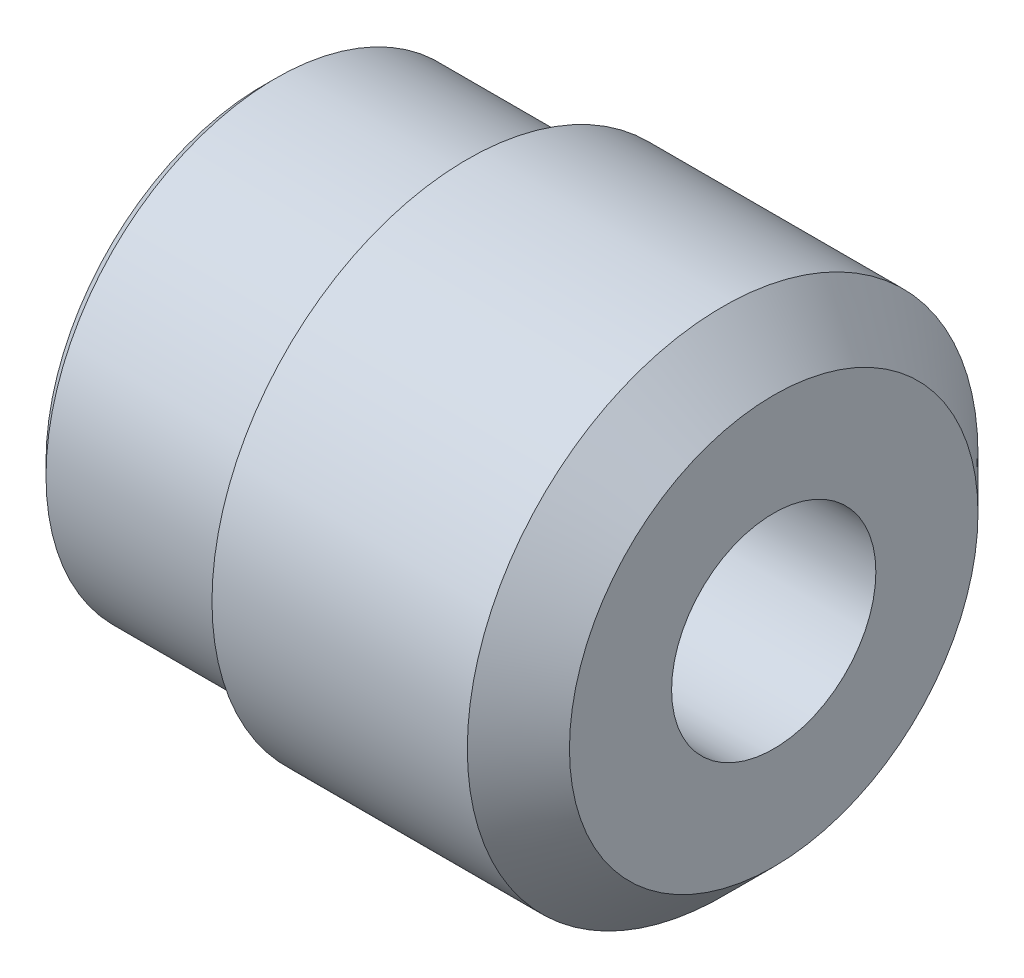
ISO-10303-21;
HEADER;
FILE_DESCRIPTION(('STEP AP214'),'2;1');
FILE_NAME('part.step','',(''),(''),'','','');
FILE_SCHEMA(('AUTOMOTIVE_DESIGN { 1 0 10303 214 1 1 1 1 }'));
ENDSEC;
DATA;
#1=APPLICATION_CONTEXT('core data for automotive mechanical design processes');
#2=APPLICATION_PROTOCOL_DEFINITION('international standard','automotive_design',2000,#1);
#3=PRODUCT_CONTEXT('',#1,'mechanical');
#4=PRODUCT('Part','Part','',(#3));
#5=PRODUCT_RELATED_PRODUCT_CATEGORY('part','',(#4));
#6=PRODUCT_DEFINITION_FORMATION('','',#4);
#7=PRODUCT_DEFINITION_CONTEXT('part definition',#1,'design');
#8=PRODUCT_DEFINITION('design','',#6,#7);
#9=PRODUCT_DEFINITION_SHAPE('','',#8);
#10=(LENGTH_UNIT() NAMED_UNIT(*) SI_UNIT(.MILLI.,.METRE.));
#11=(NAMED_UNIT(*) PLANE_ANGLE_UNIT() SI_UNIT($,.RADIAN.));
#12=(NAMED_UNIT(*) SI_UNIT($,.STERADIAN.) SOLID_ANGLE_UNIT());
#13=UNCERTAINTY_MEASURE_WITH_UNIT(LENGTH_MEASURE(1.E-05),#10,'distance_accuracy_value','');
#14=(GEOMETRIC_REPRESENTATION_CONTEXT(3) GLOBAL_UNCERTAINTY_ASSIGNED_CONTEXT((#13)) GLOBAL_UNIT_ASSIGNED_CONTEXT((#10,
#11,#12)) REPRESENTATION_CONTEXT('',''));
#15=CARTESIAN_POINT('',(0.,0.,0.));
#16=DIRECTION('',(0.,0.,1.));
#17=DIRECTION('',(1.,0.,0.));
#18=AXIS2_PLACEMENT_3D('',#15,#16,#17);
#19=CARTESIAN_POINT('',(0.,0.,0.));
#20=DIRECTION('',(-1.,0.,0.));
#21=DIRECTION('',(0.,0.,1.));
#22=AXIS2_PLACEMENT_3D('',#19,#20,#21);
#23=CYLINDRICAL_SURFACE('',#22,9.);
#24=CARTESIAN_POINT('',(0.500000000000004,0.,0.));
#25=DIRECTION('',(-1.,0.,0.));
#26=DIRECTION('',(0.,0.,1.));
#27=AXIS2_PLACEMENT_3D('',#24,#25,#26);
#28=CIRCLE('',#27,9.);
#29=CARTESIAN_POINT('',(0.500000000000004,0.,9.));
#30=VERTEX_POINT('',#29);
#31=EDGE_CURVE('E10',#30,#30,#28,.F.);
#32=ORIENTED_EDGE('',*,*,#31,.T.);
#33=EDGE_LOOP('',(#32));
#34=FACE_BOUND('',#33,.T.);
#35=CARTESIAN_POINT('',(8.,0.,0.));
#36=DIRECTION('',(-1.,0.,0.));
#37=DIRECTION('',(0.,0.,1.));
#38=AXIS2_PLACEMENT_3D('',#35,#36,#37);
#39=CIRCLE('',#38,9.);
#40=CARTESIAN_POINT('',(8.,0.,9.));
#41=VERTEX_POINT('',#40);
#42=EDGE_CURVE('E63',#41,#41,#39,.T.);
#43=ORIENTED_EDGE('',*,*,#42,.T.);
#44=EDGE_LOOP('',(#43));
#45=FACE_BOUND('',#44,.T.);
#46=ADVANCED_FACE('F29',(#34,#45),#23,.T.);
#47=CARTESIAN_POINT('',(0.,6.,0.));
#48=DIRECTION('',(-1.,0.,0.));
#49=DIRECTION('',(0.,0.,1.));
#50=AXIS2_PLACEMENT_3D('',#47,#48,#49);
#51=PLANE('',#50);
#52=CARTESIAN_POINT('',(0.,0.,0.));
#53=DIRECTION('',(-1.,0.,0.));
#54=DIRECTION('',(0.,0.,1.));
#55=AXIS2_PLACEMENT_3D('',#52,#53,#54);
#56=CIRCLE('',#55,8.49999999999999);
#57=CARTESIAN_POINT('',(0.,0.,8.49999999999999));
#58=VERTEX_POINT('',#57);
#59=EDGE_CURVE('E35',#58,#58,#56,.T.);
#60=ORIENTED_EDGE('',*,*,#59,.T.);
#61=EDGE_LOOP('',(#60));
#62=FACE_BOUND('',#61,.T.);
#63=CARTESIAN_POINT('',(0.,0.,0.));
#64=DIRECTION('',(-1.,0.,0.));
#65=DIRECTION('',(0.,0.,1.));
#66=AXIS2_PLACEMENT_3D('',#63,#64,#65);
#67=CIRCLE('',#66,6.);
#68=CARTESIAN_POINT('',(0.,0.,6.));
#69=VERTEX_POINT('',#68);
#70=EDGE_CURVE('E48',#69,#69,#67,.T.);
#71=ORIENTED_EDGE('',*,*,#70,.F.);
#72=EDGE_LOOP('',(#71));
#73=FACE_BOUND('',#72,.T.);
#74=ADVANCED_FACE('F85',(#62,#73),#51,.T.);
#75=CARTESIAN_POINT('',(0.,0.,0.));
#76=DIRECTION('',(-1.,0.,0.));
#77=DIRECTION('',(0.,0.,1.));
#78=AXIS2_PLACEMENT_3D('',#75,#76,#77);
#79=CYLINDRICAL_SURFACE('',#78,6.);
#80=CARTESIAN_POINT('',(14.,0.,0.));
#81=DIRECTION('',(-1.,0.,0.));
#82=DIRECTION('',(0.,0.,1.));
#83=AXIS2_PLACEMENT_3D('',#80,#81,#82);
#84=CIRCLE('',#83,6.);
#85=CARTESIAN_POINT('',(14.,0.,6.));
#86=VERTEX_POINT('',#85);
#87=EDGE_CURVE('E51',#86,#86,#84,.T.);
#88=ORIENTED_EDGE('',*,*,#87,.F.);
#89=EDGE_LOOP('',(#88));
#90=FACE_BOUND('',#89,.T.);
#91=ORIENTED_EDGE('',*,*,#70,.T.);
#92=EDGE_LOOP('',(#91));
#93=FACE_BOUND('',#92,.T.);
#94=ADVANCED_FACE('F89',(#90,#93),#79,.F.);
#95=CARTESIAN_POINT('',(14.,6.,0.));
#96=DIRECTION('',(1.,0.,0.));
#97=DIRECTION('',(0.,0.,-1.));
#98=AXIS2_PLACEMENT_3D('',#95,#96,#97);
#99=PLANE('',#98);
#100=CARTESIAN_POINT('',(14.,0.,0.));
#101=DIRECTION('',(-1.,0.,0.));
#102=DIRECTION('',(0.,0.,1.));
#103=AXIS2_PLACEMENT_3D('',#100,#101,#102);
#104=CIRCLE('',#103,4.);
#105=CARTESIAN_POINT('',(14.,0.,4.));
#106=VERTEX_POINT('',#105);
#107=EDGE_CURVE('E54',#106,#106,#104,.T.);
#108=ORIENTED_EDGE('',*,*,#107,.F.);
#109=EDGE_LOOP('',(#108));
#110=FACE_BOUND('',#109,.T.);
#111=ORIENTED_EDGE('',*,*,#87,.T.);
#112=EDGE_LOOP('',(#111));
#113=FACE_BOUND('',#112,.T.);
#114=ADVANCED_FACE('F93',(#110,#113),#99,.F.);
#115=CARTESIAN_POINT('',(0.,0.,0.));
#116=DIRECTION('',(-1.,0.,0.));
#117=DIRECTION('',(0.,0.,1.));
#118=AXIS2_PLACEMENT_3D('',#115,#116,#117);
#119=CYLINDRICAL_SURFACE('',#118,4.);
#120=CARTESIAN_POINT('',(20.,0.,0.));
#121=DIRECTION('',(-1.,0.,0.));
#122=DIRECTION('',(0.,0.,1.));
#123=AXIS2_PLACEMENT_3D('',#120,#121,#122);
#124=CIRCLE('',#123,4.);
#125=CARTESIAN_POINT('',(20.,0.,4.));
#126=VERTEX_POINT('',#125);
#127=EDGE_CURVE('E57',#126,#126,#124,.T.);
#128=ORIENTED_EDGE('',*,*,#127,.F.);
#129=EDGE_LOOP('',(#128));
#130=FACE_BOUND('',#129,.T.);
#131=ORIENTED_EDGE('',*,*,#107,.T.);
#132=EDGE_LOOP('',(#131));
#133=FACE_BOUND('',#132,.T.);
#134=ADVANCED_FACE('F100',(#130,#133),#119,.F.);
#135=CARTESIAN_POINT('',(20.,10.,0.));
#136=DIRECTION('',(1.,0.,0.));
#137=DIRECTION('',(0.,0.,-1.));
#138=AXIS2_PLACEMENT_3D('',#135,#136,#137);
#139=PLANE('',#138);
#140=CARTESIAN_POINT('',(20.,0.,0.));
#141=DIRECTION('',(1.,0.,0.));
#142=DIRECTION('',(0.,0.,-1.));
#143=AXIS2_PLACEMENT_3D('',#140,#141,#142);
#144=CIRCLE('',#143,7.99999999999999);
#145=CARTESIAN_POINT('',(20.,0.,-7.99999999999999));
#146=VERTEX_POINT('',#145);
#147=EDGE_CURVE('E39',#146,#146,#144,.T.);
#148=ORIENTED_EDGE('',*,*,#147,.T.);
#149=EDGE_LOOP('',(#148));
#150=FACE_BOUND('',#149,.T.);
#151=ORIENTED_EDGE('',*,*,#127,.T.);
#152=EDGE_LOOP('',(#151));
#153=FACE_BOUND('',#152,.T.);
#154=ADVANCED_FACE('F81',(#150,#153),#139,.T.);
#155=CARTESIAN_POINT('',(0.,0.,0.));
#156=DIRECTION('',(-1.,0.,0.));
#157=DIRECTION('',(0.,0.,1.));
#158=AXIS2_PLACEMENT_3D('',#155,#156,#157);
#159=CYLINDRICAL_SURFACE('',#158,10.);
#160=CARTESIAN_POINT('',(18.,0.,0.));
#161=DIRECTION('',(1.,0.,0.));
#162=DIRECTION('',(0.,0.,-1.));
#163=AXIS2_PLACEMENT_3D('',#160,#161,#162);
#164=CIRCLE('',#163,10.);
#165=CARTESIAN_POINT('',(18.,0.,-10.));
#166=VERTEX_POINT('',#165);
#167=EDGE_CURVE('E43',#166,#166,#164,.F.);
#168=ORIENTED_EDGE('',*,*,#167,.T.);
#169=EDGE_LOOP('',(#168));
#170=FACE_BOUND('',#169,.T.);
#171=CARTESIAN_POINT('',(8.,0.,0.));
#172=DIRECTION('',(-1.,0.,0.));
#173=DIRECTION('',(0.,0.,1.));
#174=AXIS2_PLACEMENT_3D('',#171,#172,#173);
#175=CIRCLE('',#174,10.);
#176=CARTESIAN_POINT('',(8.,0.,10.));
#177=VERTEX_POINT('',#176);
#178=EDGE_CURVE('E60',#177,#177,#175,.T.);
#179=ORIENTED_EDGE('',*,*,#178,.F.);
#180=EDGE_LOOP('',(#179));
#181=FACE_BOUND('',#180,.T.);
#182=ADVANCED_FACE('F71',(#170,#181),#159,.T.);
#183=CARTESIAN_POINT('',(8.,9.,0.));
#184=DIRECTION('',(-1.,0.,0.));
#185=DIRECTION('',(0.,0.,1.));
#186=AXIS2_PLACEMENT_3D('',#183,#184,#185);
#187=PLANE('',#186);
#188=ORIENTED_EDGE('',*,*,#178,.T.);
#189=EDGE_LOOP('',(#188));
#190=FACE_BOUND('',#189,.T.);
#191=ORIENTED_EDGE('',*,*,#42,.F.);
#192=EDGE_LOOP('',(#191));
#193=FACE_BOUND('',#192,.T.);
#194=ADVANCED_FACE('F68',(#190,#193),#187,.T.);
#195=CARTESIAN_POINT('',(18.,0.,0.));
#196=DIRECTION('',(-1.,0.,0.));
#197=DIRECTION('',(0.,0.,1.));
#198=AXIS2_PLACEMENT_3D('',#195,#196,#197);
#199=CONICAL_SURFACE('',#198,10.,0.785398163397443);
#200=ORIENTED_EDGE('',*,*,#147,.F.);
#201=EDGE_LOOP('',(#200));
#202=FACE_BOUND('',#201,.T.);
#203=ORIENTED_EDGE('',*,*,#167,.F.);
#204=EDGE_LOOP('',(#203));
#205=FACE_BOUND('',#204,.T.);
#206=ADVANCED_FACE('F70',(#202,#205),#199,.T.);
#207=CARTESIAN_POINT('',(0.,0.,0.));
#208=DIRECTION('',(1.,0.,0.));
#209=DIRECTION('',(0.,0.,-1.));
#210=AXIS2_PLACEMENT_3D('',#207,#208,#209);
#211=CONICAL_SURFACE('',#210,8.49999999999999,0.785398163397454);
#212=ORIENTED_EDGE('',*,*,#31,.F.);
#213=EDGE_LOOP('',(#212));
#214=FACE_BOUND('',#213,.T.);
#215=ORIENTED_EDGE('',*,*,#59,.F.);
#216=EDGE_LOOP('',(#215));
#217=FACE_BOUND('',#216,.T.);
#218=ADVANCED_FACE('F78',(#214,#217),#211,.T.);
#219=CLOSED_SHELL('',(#46,#74,#94,#114,#134,#154,#182,#194,#206,#218));
#220=MANIFOLD_SOLID_BREP('B2',#219);
#221=ADVANCED_BREP_SHAPE_REPRESENTATION('',(#18,#220),#14);
#222=SHAPE_DEFINITION_REPRESENTATION(#9,#221);
ENDSEC;
END-ISO-10303-21;
